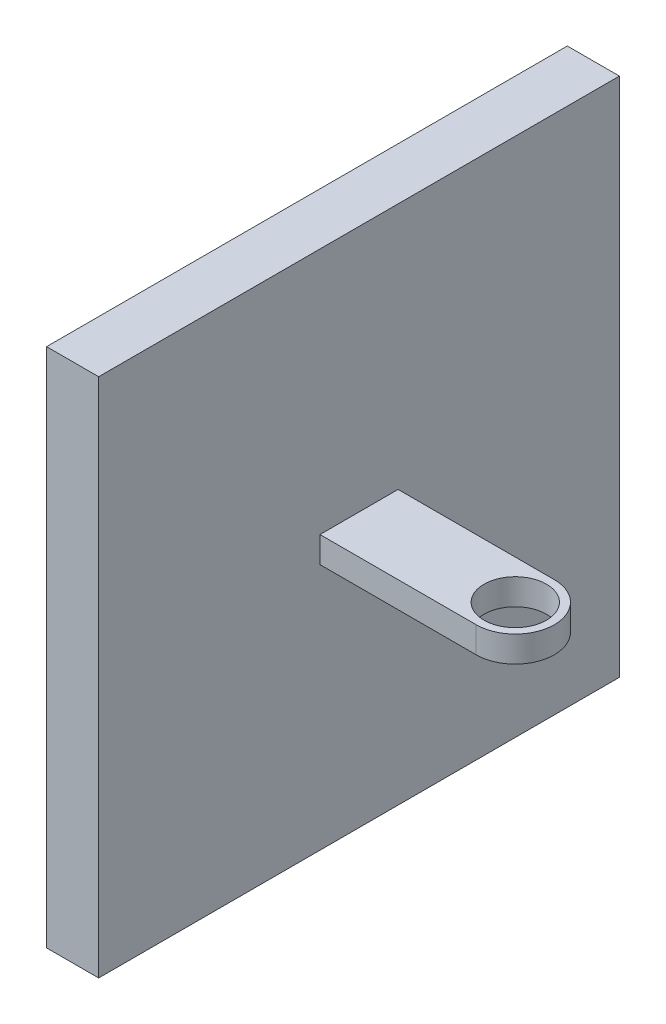
ISO-10303-21;
HEADER;
FILE_DESCRIPTION(('STEP AP214'),'2;1');
FILE_NAME('part.step','',(''),(''),'','','');
FILE_SCHEMA(('AUTOMOTIVE_DESIGN { 1 0 10303 214 1 1 1 1 }'));
ENDSEC;
DATA;
#1=APPLICATION_CONTEXT('core data for automotive mechanical design processes');
#2=APPLICATION_PROTOCOL_DEFINITION('international standard','automotive_design',2000,#1);
#3=PRODUCT_CONTEXT('',#1,'mechanical');
#4=PRODUCT('Part','Part','',(#3));
#5=PRODUCT_RELATED_PRODUCT_CATEGORY('part','',(#4));
#6=PRODUCT_DEFINITION_FORMATION('','',#4);
#7=PRODUCT_DEFINITION_CONTEXT('part definition',#1,'design');
#8=PRODUCT_DEFINITION('design','',#6,#7);
#9=PRODUCT_DEFINITION_SHAPE('','',#8);
#10=(LENGTH_UNIT() NAMED_UNIT(*) SI_UNIT(.MILLI.,.METRE.));
#11=(NAMED_UNIT(*) PLANE_ANGLE_UNIT() SI_UNIT($,.RADIAN.));
#12=(NAMED_UNIT(*) SI_UNIT($,.STERADIAN.) SOLID_ANGLE_UNIT());
#13=UNCERTAINTY_MEASURE_WITH_UNIT(LENGTH_MEASURE(1.E-05),#10,'distance_accuracy_value','');
#14=(GEOMETRIC_REPRESENTATION_CONTEXT(3) GLOBAL_UNCERTAINTY_ASSIGNED_CONTEXT((#13)) GLOBAL_UNIT_ASSIGNED_CONTEXT((#10,
#11,#12)) REPRESENTATION_CONTEXT('',''));
#15=CARTESIAN_POINT('',(0.,0.,0.));
#16=DIRECTION('',(0.,0.,1.));
#17=DIRECTION('',(1.,0.,0.));
#18=AXIS2_PLACEMENT_3D('',#15,#16,#17);
#19=CARTESIAN_POINT('',(9.,4.75,-5.75));
#20=DIRECTION('',(0.,0.,1.));
#21=DIRECTION('',(1.,0.,0.));
#22=AXIS2_PLACEMENT_3D('',#19,#20,#21);
#23=PLANE('',#22);
#24=DIRECTION('',(0.,-1.,0.));
#25=VECTOR('',#24,1.);
#26=CARTESIAN_POINT('',(4.,6.75,-5.75));
#27=LINE('',#26,#25);
#28=CARTESIAN_POINT('',(4.,5.25,-5.75));
#29=VERTEX_POINT('',#28);
#30=CARTESIAN_POINT('',(4.,4.75,-5.75));
#31=VERTEX_POINT('',#30);
#32=EDGE_CURVE('E102',#29,#31,#27,.T.);
#33=ORIENTED_EDGE('',*,*,#32,.T.);
#34=DIRECTION('',(-1.,0.,0.));
#35=VECTOR('',#34,1.);
#36=CARTESIAN_POINT('',(9.,4.75,-5.75));
#37=LINE('',#36,#35);
#38=CARTESIAN_POINT('',(1.,4.75,-5.75));
#39=VERTEX_POINT('',#38);
#40=EDGE_CURVE('E110',#31,#39,#37,.T.);
#41=ORIENTED_EDGE('',*,*,#40,.T.);
#42=DIRECTION('',(0.,1.,0.));
#43=VECTOR('',#42,1.);
#44=CARTESIAN_POINT('',(1.,4.75,-5.75));
#45=LINE('',#44,#43);
#46=CARTESIAN_POINT('',(1.,5.25,-5.75));
#47=VERTEX_POINT('',#46);
#48=EDGE_CURVE('E284',#39,#47,#45,.T.);
#49=ORIENTED_EDGE('',*,*,#48,.T.);
#50=DIRECTION('',(-1.,0.,0.));
#51=VECTOR('',#50,1.);
#52=CARTESIAN_POINT('',(9.,5.25,-5.75));
#53=LINE('',#52,#51);
#54=EDGE_CURVE('E58',#29,#47,#53,.T.);
#55=ORIENTED_EDGE('',*,*,#54,.F.);
#56=EDGE_LOOP('',(#33,#41,#49,#55));
#57=FACE_BOUND('',#56,.T.);
#58=ADVANCED_FACE('F35',(#57),#23,.F.);
#59=CARTESIAN_POINT('',(9.,5.25,-4.25));
#60=DIRECTION('',(0.,-1.,0.));
#61=DIRECTION('',(0.,0.,-1.));
#62=AXIS2_PLACEMENT_3D('',#59,#60,#61);
#63=PLANE('',#62);
#64=CARTESIAN_POINT('',(4.,5.25,-5.));
#65=DIRECTION('',(0.,-1.,0.));
#66=DIRECTION('',(0.,0.,-1.));
#67=AXIS2_PLACEMENT_3D('',#64,#65,#66);
#68=CIRCLE('',#67,0.6);
#69=CARTESIAN_POINT('',(4.,5.25,-5.6));
#70=VERTEX_POINT('',#69);
#71=EDGE_CURVE('E106',#70,#70,#68,.T.);
#72=ORIENTED_EDGE('',*,*,#71,.T.);
#73=EDGE_LOOP('',(#72));
#74=FACE_BOUND('',#73,.T.);
#75=DIRECTION('',(-1.,0.,0.));
#76=VECTOR('',#75,1.);
#77=CARTESIAN_POINT('',(9.,5.25,-4.25));
#78=LINE('',#77,#76);
#79=CARTESIAN_POINT('',(4.,5.25,-4.25));
#80=VERTEX_POINT('',#79);
#81=CARTESIAN_POINT('',(1.,5.25,-4.25));
#82=VERTEX_POINT('',#81);
#83=EDGE_CURVE('E120',#80,#82,#78,.T.);
#84=ORIENTED_EDGE('',*,*,#83,.F.);
#85=CARTESIAN_POINT('',(4.,5.25,-5.));
#86=DIRECTION('',(0.,-1.,0.));
#87=DIRECTION('',(0.,0.,-1.));
#88=AXIS2_PLACEMENT_3D('',#85,#86,#87);
#89=CIRCLE('',#88,0.75);
#90=EDGE_CURVE('E112',#80,#29,#89,.F.);
#91=ORIENTED_EDGE('',*,*,#90,.T.);
#92=ORIENTED_EDGE('',*,*,#54,.T.);
#93=DIRECTION('',(0.,0.,1.));
#94=VECTOR('',#93,1.);
#95=CARTESIAN_POINT('',(1.,5.25,-4.25));
#96=LINE('',#95,#94);
#97=EDGE_CURVE('E286',#47,#82,#96,.T.);
#98=ORIENTED_EDGE('',*,*,#97,.T.);
#99=EDGE_LOOP('',(#84,#91,#92,#98));
#100=FACE_BOUND('',#99,.T.);
#101=ADVANCED_FACE('F181',(#74,#100),#63,.F.);
#102=CARTESIAN_POINT('',(9.,4.75,-4.25));
#103=DIRECTION('',(0.,1.,0.));
#104=DIRECTION('',(0.,0.,1.));
#105=AXIS2_PLACEMENT_3D('',#102,#103,#104);
#106=PLANE('',#105);
#107=CARTESIAN_POINT('',(4.,4.75,-5.));
#108=DIRECTION('',(0.,-1.,0.));
#109=DIRECTION('',(0.,0.,-1.));
#110=AXIS2_PLACEMENT_3D('',#107,#108,#109);
#111=CIRCLE('',#110,0.6);
#112=CARTESIAN_POINT('',(4.,4.75,-5.6));
#113=VERTEX_POINT('',#112);
#114=EDGE_CURVE('E277',#113,#113,#111,.T.);
#115=ORIENTED_EDGE('',*,*,#114,.F.);
#116=EDGE_LOOP('',(#115));
#117=FACE_BOUND('',#116,.T.);
#118=ORIENTED_EDGE('',*,*,#40,.F.);
#119=CARTESIAN_POINT('',(4.,4.75,-5.));
#120=DIRECTION('',(0.,-1.,0.));
#121=DIRECTION('',(0.,0.,-1.));
#122=AXIS2_PLACEMENT_3D('',#119,#120,#121);
#123=CIRCLE('',#122,0.75);
#124=CARTESIAN_POINT('',(4.,4.75,-4.25));
#125=VERTEX_POINT('',#124);
#126=EDGE_CURVE('E99',#125,#31,#123,.F.);
#127=ORIENTED_EDGE('',*,*,#126,.F.);
#128=DIRECTION('',(-1.,0.,0.));
#129=VECTOR('',#128,1.);
#130=CARTESIAN_POINT('',(9.,4.75,-4.25));
#131=LINE('',#130,#129);
#132=CARTESIAN_POINT('',(1.,4.75,-4.25));
#133=VERTEX_POINT('',#132);
#134=EDGE_CURVE('E118',#125,#133,#131,.T.);
#135=ORIENTED_EDGE('',*,*,#134,.T.);
#136=DIRECTION('',(0.,0.,-1.));
#137=VECTOR('',#136,1.);
#138=CARTESIAN_POINT('',(1.,4.75,-4.25));
#139=LINE('',#138,#137);
#140=EDGE_CURVE('E117',#133,#39,#139,.T.);
#141=ORIENTED_EDGE('',*,*,#140,.T.);
#142=EDGE_LOOP('',(#118,#127,#135,#141));
#143=FACE_BOUND('',#142,.T.);
#144=ADVANCED_FACE('F115',(#117,#143),#106,.F.);
#145=CARTESIAN_POINT('',(1.,0.,0.));
#146=DIRECTION('',(-1.,0.,0.));
#147=DIRECTION('',(0.,0.,1.));
#148=AXIS2_PLACEMENT_3D('',#145,#146,#147);
#149=PLANE('',#148);
#150=DIRECTION('',(0.,-1.,0.));
#151=VECTOR('',#150,1.);
#152=CARTESIAN_POINT('',(1.,0.,0.));
#153=LINE('',#152,#151);
#154=CARTESIAN_POINT('',(1.,10.,0.));
#155=VERTEX_POINT('',#154);
#156=CARTESIAN_POINT('',(1.,0.,0.));
#157=VERTEX_POINT('',#156);
#158=EDGE_CURVE('E129',#155,#157,#153,.T.);
#159=ORIENTED_EDGE('',*,*,#158,.T.);
#160=DIRECTION('',(0.,0.,-1.));
#161=VECTOR('',#160,1.);
#162=CARTESIAN_POINT('',(1.,0.,0.));
#163=LINE('',#162,#161);
#164=CARTESIAN_POINT('',(1.,0.,-10.));
#165=VERTEX_POINT('',#164);
#166=EDGE_CURVE('E132',#157,#165,#163,.T.);
#167=ORIENTED_EDGE('',*,*,#166,.T.);
#168=DIRECTION('',(0.,1.,0.));
#169=VECTOR('',#168,1.);
#170=CARTESIAN_POINT('',(1.,0.,-10.));
#171=LINE('',#170,#169);
#172=CARTESIAN_POINT('',(1.,10.,-10.));
#173=VERTEX_POINT('',#172);
#174=EDGE_CURVE('E135',#165,#173,#171,.T.);
#175=ORIENTED_EDGE('',*,*,#174,.T.);
#176=DIRECTION('',(0.,0.,1.));
#177=VECTOR('',#176,1.);
#178=CARTESIAN_POINT('',(1.,10.,0.));
#179=LINE('',#178,#177);
#180=EDGE_CURVE('E137',#173,#155,#179,.T.);
#181=ORIENTED_EDGE('',*,*,#180,.T.);
#182=EDGE_LOOP('',(#159,#167,#175,#181));
#183=FACE_BOUND('',#182,.T.);
#184=ORIENTED_EDGE('',*,*,#48,.F.);
#185=ORIENTED_EDGE('',*,*,#140,.F.);
#186=DIRECTION('',(0.,-1.,0.));
#187=VECTOR('',#186,1.);
#188=CARTESIAN_POINT('',(1.,4.75,-4.25));
#189=LINE('',#188,#187);
#190=EDGE_CURVE('E122',#82,#133,#189,.T.);
#191=ORIENTED_EDGE('',*,*,#190,.F.);
#192=ORIENTED_EDGE('',*,*,#97,.F.);
#193=EDGE_LOOP('',(#184,#185,#191,#192));
#194=FACE_BOUND('',#193,.T.);
#195=ADVANCED_FACE('F171',(#183,#194),#149,.F.);
#196=CARTESIAN_POINT('',(1.,0.,0.));
#197=DIRECTION('',(0.,0.,-1.));
#198=DIRECTION('',(-1.,0.,0.));
#199=AXIS2_PLACEMENT_3D('',#196,#197,#198);
#200=PLANE('',#199);
#201=DIRECTION('',(0.,-1.,0.));
#202=VECTOR('',#201,1.);
#203=CARTESIAN_POINT('',(0.,0.,0.));
#204=LINE('',#203,#202);
#205=CARTESIAN_POINT('',(0.,10.,0.));
#206=VERTEX_POINT('',#205);
#207=CARTESIAN_POINT('',(0.,0.,0.));
#208=VERTEX_POINT('',#207);
#209=EDGE_CURVE('E128',#206,#208,#204,.T.);
#210=ORIENTED_EDGE('',*,*,#209,.T.);
#211=DIRECTION('',(-1.,0.,0.));
#212=VECTOR('',#211,1.);
#213=CARTESIAN_POINT('',(1.,0.,0.));
#214=LINE('',#213,#212);
#215=EDGE_CURVE('E11',#157,#208,#214,.T.);
#216=ORIENTED_EDGE('',*,*,#215,.F.);
#217=ORIENTED_EDGE('',*,*,#158,.F.);
#218=DIRECTION('',(-1.,0.,0.));
#219=VECTOR('',#218,1.);
#220=CARTESIAN_POINT('',(1.,10.,0.));
#221=LINE('',#220,#219);
#222=EDGE_CURVE('E139',#155,#206,#221,.T.);
#223=ORIENTED_EDGE('',*,*,#222,.T.);
#224=EDGE_LOOP('',(#210,#216,#217,#223));
#225=FACE_BOUND('',#224,.T.);
#226=ADVANCED_FACE('F37',(#225),#200,.F.);
#227=CARTESIAN_POINT('',(1.,0.,0.));
#228=DIRECTION('',(0.,1.,0.));
#229=DIRECTION('',(0.,0.,1.));
#230=AXIS2_PLACEMENT_3D('',#227,#228,#229);
#231=PLANE('',#230);
#232=DIRECTION('',(0.,0.,-1.));
#233=VECTOR('',#232,1.);
#234=CARTESIAN_POINT('',(0.,0.,0.));
#235=LINE('',#234,#233);
#236=CARTESIAN_POINT('',(0.,0.,-10.));
#237=VERTEX_POINT('',#236);
#238=EDGE_CURVE('E142',#208,#237,#235,.T.);
#239=ORIENTED_EDGE('',*,*,#238,.T.);
#240=DIRECTION('',(-1.,0.,0.));
#241=VECTOR('',#240,1.);
#242=CARTESIAN_POINT('',(1.,0.,-10.));
#243=LINE('',#242,#241);
#244=EDGE_CURVE('E43',#165,#237,#243,.T.);
#245=ORIENTED_EDGE('',*,*,#244,.F.);
#246=ORIENTED_EDGE('',*,*,#166,.F.);
#247=ORIENTED_EDGE('',*,*,#215,.T.);
#248=EDGE_LOOP('',(#239,#245,#246,#247));
#249=FACE_BOUND('',#248,.T.);
#250=ADVANCED_FACE('F173',(#249),#231,.F.);
#251=CARTESIAN_POINT('',(1.,0.,-10.));
#252=DIRECTION('',(0.,0.,1.));
#253=DIRECTION('',(1.,0.,0.));
#254=AXIS2_PLACEMENT_3D('',#251,#252,#253);
#255=PLANE('',#254);
#256=DIRECTION('',(0.,1.,0.));
#257=VECTOR('',#256,1.);
#258=CARTESIAN_POINT('',(0.,0.,-10.));
#259=LINE('',#258,#257);
#260=CARTESIAN_POINT('',(0.,10.,-10.));
#261=VERTEX_POINT('',#260);
#262=EDGE_CURVE('E144',#237,#261,#259,.T.);
#263=ORIENTED_EDGE('',*,*,#262,.T.);
#264=DIRECTION('',(-1.,0.,0.));
#265=VECTOR('',#264,1.);
#266=CARTESIAN_POINT('',(1.,10.,-10.));
#267=LINE('',#266,#265);
#268=EDGE_CURVE('E149',#173,#261,#267,.T.);
#269=ORIENTED_EDGE('',*,*,#268,.F.);
#270=ORIENTED_EDGE('',*,*,#174,.F.);
#271=ORIENTED_EDGE('',*,*,#244,.T.);
#272=EDGE_LOOP('',(#263,#269,#270,#271));
#273=FACE_BOUND('',#272,.T.);
#274=ADVANCED_FACE('F156',(#273),#255,.F.);
#275=CARTESIAN_POINT('',(1.,10.,0.));
#276=DIRECTION('',(0.,-1.,0.));
#277=DIRECTION('',(0.,0.,-1.));
#278=AXIS2_PLACEMENT_3D('',#275,#276,#277);
#279=PLANE('',#278);
#280=DIRECTION('',(0.,0.,1.));
#281=VECTOR('',#280,1.);
#282=CARTESIAN_POINT('',(0.,10.,0.));
#283=LINE('',#282,#281);
#284=EDGE_CURVE('E133',#261,#206,#283,.T.);
#285=ORIENTED_EDGE('',*,*,#284,.T.);
#286=ORIENTED_EDGE('',*,*,#222,.F.);
#287=ORIENTED_EDGE('',*,*,#180,.F.);
#288=ORIENTED_EDGE('',*,*,#268,.T.);
#289=EDGE_LOOP('',(#285,#286,#287,#288));
#290=FACE_BOUND('',#289,.T.);
#291=ADVANCED_FACE('F165',(#290),#279,.F.);
#292=CARTESIAN_POINT('',(0.,0.,0.));
#293=DIRECTION('',(-1.,0.,0.));
#294=DIRECTION('',(0.,0.,1.));
#295=AXIS2_PLACEMENT_3D('',#292,#293,#294);
#296=PLANE('',#295);
#297=ORIENTED_EDGE('',*,*,#209,.F.);
#298=ORIENTED_EDGE('',*,*,#284,.F.);
#299=ORIENTED_EDGE('',*,*,#262,.F.);
#300=ORIENTED_EDGE('',*,*,#238,.F.);
#301=EDGE_LOOP('',(#297,#298,#299,#300));
#302=FACE_BOUND('',#301,.T.);
#303=ADVANCED_FACE('F162',(#302),#296,.T.);
#304=CARTESIAN_POINT('',(9.,4.75,-4.25));
#305=DIRECTION('',(0.,0.,-1.));
#306=DIRECTION('',(-1.,0.,0.));
#307=AXIS2_PLACEMENT_3D('',#304,#305,#306);
#308=PLANE('',#307);
#309=ORIENTED_EDGE('',*,*,#134,.F.);
#310=DIRECTION('',(0.,-1.,0.));
#311=VECTOR('',#310,1.);
#312=CARTESIAN_POINT('',(4.,6.75,-4.25));
#313=LINE('',#312,#311);
#314=EDGE_CURVE('E50',#80,#125,#313,.T.);
#315=ORIENTED_EDGE('',*,*,#314,.F.);
#316=ORIENTED_EDGE('',*,*,#83,.T.);
#317=ORIENTED_EDGE('',*,*,#190,.T.);
#318=EDGE_LOOP('',(#309,#315,#316,#317));
#319=FACE_BOUND('',#318,.T.);
#320=ADVANCED_FACE('F194',(#319),#308,.F.);
#321=CARTESIAN_POINT('',(4.,6.75,-5.));
#322=DIRECTION('',(0.,-1.,0.));
#323=DIRECTION('',(0.,0.,-1.));
#324=AXIS2_PLACEMENT_3D('',#321,#322,#323);
#325=CYLINDRICAL_SURFACE('',#324,0.75);
#326=ORIENTED_EDGE('',*,*,#314,.T.);
#327=ORIENTED_EDGE('',*,*,#126,.T.);
#328=ORIENTED_EDGE('',*,*,#32,.F.);
#329=ORIENTED_EDGE('',*,*,#90,.F.);
#330=EDGE_LOOP('',(#326,#327,#328,#329));
#331=FACE_BOUND('',#330,.T.);
#332=ADVANCED_FACE('F101',(#331),#325,.T.);
#333=CARTESIAN_POINT('',(4.,6.75,-5.));
#334=DIRECTION('',(0.,-1.,0.));
#335=DIRECTION('',(0.,0.,-1.));
#336=AXIS2_PLACEMENT_3D('',#333,#334,#335);
#337=CYLINDRICAL_SURFACE('',#336,0.6);
#338=ORIENTED_EDGE('',*,*,#114,.T.);
#339=EDGE_LOOP('',(#338));
#340=FACE_BOUND('',#339,.T.);
#341=ORIENTED_EDGE('',*,*,#71,.F.);
#342=EDGE_LOOP('',(#341));
#343=FACE_BOUND('',#342,.T.);
#344=ADVANCED_FACE('F217',(#340,#343),#337,.F.);
#345=CLOSED_SHELL('',(#58,#101,#144,#195,#226,#250,#274,#291,#303,#320,#332,#344));
#346=MANIFOLD_SOLID_BREP('B2',#345);
#347=ADVANCED_BREP_SHAPE_REPRESENTATION('',(#18,#346),#14);
#348=SHAPE_DEFINITION_REPRESENTATION(#9,#347);
ENDSEC;
END-ISO-10303-21;
